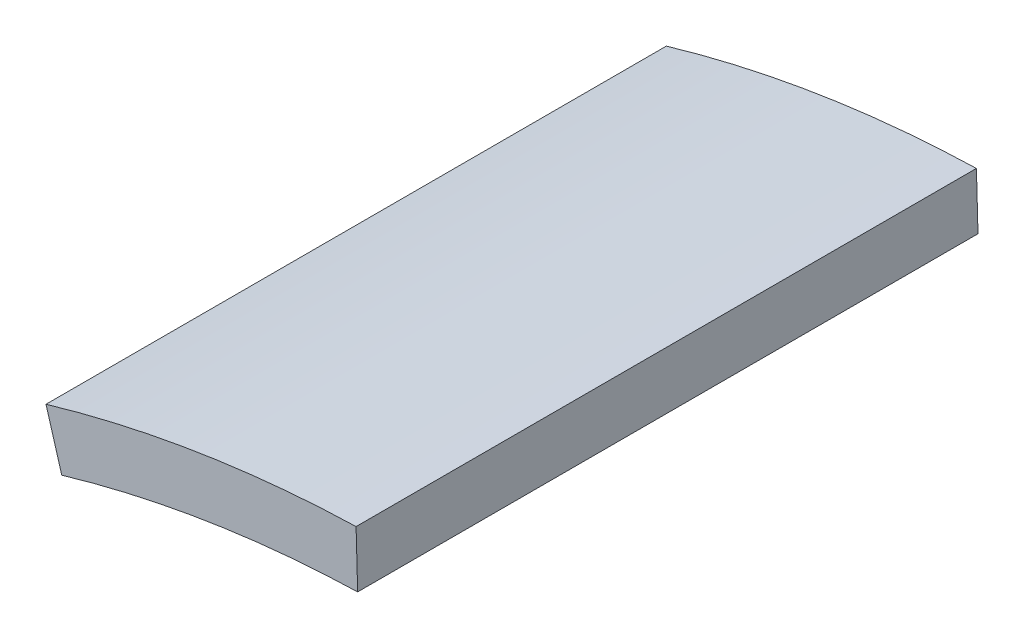
ISO-10303-21;
HEADER;
FILE_DESCRIPTION(('STEP AP214'),'2;1');
FILE_NAME('part.step','',(''),(''),'','','');
FILE_SCHEMA(('AUTOMOTIVE_DESIGN { 1 0 10303 214 1 1 1 1 }'));
ENDSEC;
DATA;
#1=APPLICATION_CONTEXT('core data for automotive mechanical design processes');
#2=APPLICATION_PROTOCOL_DEFINITION('international standard','automotive_design',2000,#1);
#3=PRODUCT_CONTEXT('',#1,'mechanical');
#4=PRODUCT('Part','Part','',(#3));
#5=PRODUCT_RELATED_PRODUCT_CATEGORY('part','',(#4));
#6=PRODUCT_DEFINITION_FORMATION('','',#4);
#7=PRODUCT_DEFINITION_CONTEXT('part definition',#1,'design');
#8=PRODUCT_DEFINITION('design','',#6,#7);
#9=PRODUCT_DEFINITION_SHAPE('','',#8);
#10=(LENGTH_UNIT() NAMED_UNIT(*) SI_UNIT(.MILLI.,.METRE.));
#11=(NAMED_UNIT(*) PLANE_ANGLE_UNIT() SI_UNIT($,.RADIAN.));
#12=(NAMED_UNIT(*) SI_UNIT($,.STERADIAN.) SOLID_ANGLE_UNIT());
#13=UNCERTAINTY_MEASURE_WITH_UNIT(LENGTH_MEASURE(1.E-05),#10,'distance_accuracy_value','');
#14=(GEOMETRIC_REPRESENTATION_CONTEXT(3) GLOBAL_UNCERTAINTY_ASSIGNED_CONTEXT((#13)) GLOBAL_UNIT_ASSIGNED_CONTEXT((#10,
#11,#12)) REPRESENTATION_CONTEXT('',''));
#15=CARTESIAN_POINT('',(0.,0.,0.));
#16=DIRECTION('',(0.,0.,1.));
#17=DIRECTION('',(1.,0.,0.));
#18=AXIS2_PLACEMENT_3D('',#15,#16,#17);
#19=CARTESIAN_POINT('',(0.,0.,50.));
#20=DIRECTION('',(0.,0.,1.));
#21=DIRECTION('',(1.,0.,0.));
#22=AXIS2_PLACEMENT_3D('',#19,#20,#21);
#23=PLANE('',#22);
#24=DIRECTION('',(-0.0282705667702734,0.999600307650257,0.));
#25=VECTOR('',#24,1.);
#26=CARTESIAN_POINT('',(-2.65743327640568,93.9624289191241,50.));
#27=LINE('',#26,#25);
#28=CARTESIAN_POINT('',(-2.65743327640568,93.9624289191241,50.));
#29=VERTEX_POINT('',#28);
#30=CARTESIAN_POINT('',(-2.78465082687191,98.4606303035503,50.));
#31=VERTEX_POINT('',#30);
#32=EDGE_CURVE('E86',#29,#31,#27,.T.);
#33=ORIENTED_EDGE('',*,*,#32,.F.);
#34=CARTESIAN_POINT('',(-3.67761376907083E-13,1.1518563880486E-12,50.));
#35=DIRECTION('',(0.,0.,1.));
#36=DIRECTION('',(1.,0.,0.));
#37=AXIS2_PLACEMENT_3D('',#34,#35,#36);
#38=CIRCLE('',#37,93.9999999999988);
#39=CARTESIAN_POINT('',(-26.5086181346121,90.18477235428,50.));
#40=VERTEX_POINT('',#39);
#41=EDGE_CURVE('E89',#40,#29,#38,.F.);
#42=ORIENTED_EDGE('',*,*,#41,.F.);
#43=DIRECTION('',(0.282006575900127,-0.959412471854044,0.));
#44=VECTOR('',#43,1.);
#45=CARTESIAN_POINT('',(-27.7776477261627,94.5021284776233,50.));
#46=LINE('',#45,#44);
#47=CARTESIAN_POINT('',(-27.7776477261627,94.5021284776233,50.));
#48=VERTEX_POINT('',#47);
#49=EDGE_CURVE('E39',#48,#40,#46,.T.);
#50=ORIENTED_EDGE('',*,*,#49,.F.);
#51=CARTESIAN_POINT('',(-3.67761376907083E-13,1.1518563880486E-12,50.));
#52=DIRECTION('',(0.,0.,1.));
#53=DIRECTION('',(1.,0.,0.));
#54=AXIS2_PLACEMENT_3D('',#51,#52,#53);
#55=CIRCLE('',#54,98.4999999999988);
#56=EDGE_CURVE('E11',#31,#48,#55,.T.);
#57=ORIENTED_EDGE('',*,*,#56,.F.);
#58=EDGE_LOOP('',(#33,#42,#50,#57));
#59=FACE_BOUND('',#58,.T.);
#60=ADVANCED_FACE('F32',(#59),#23,.F.);
#61=CARTESIAN_POINT('',(-27.7776477261627,94.5021284776233,100.));
#62=DIRECTION('',(0.959412471854044,0.282006575900127,0.));
#63=DIRECTION('',(-0.282006575900127,0.959412471854044,0.));
#64=AXIS2_PLACEMENT_3D('',#61,#62,#63);
#65=PLANE('',#64);
#66=DIRECTION('',(0.,0.,-1.));
#67=VECTOR('',#66,1.);
#68=CARTESIAN_POINT('',(-27.7776477261627,94.5021284776233,100.));
#69=LINE('',#68,#67);
#70=CARTESIAN_POINT('',(-27.7776477261627,94.5021284776233,100.));
#71=VERTEX_POINT('',#70);
#72=EDGE_CURVE('E71',#71,#48,#69,.T.);
#73=ORIENTED_EDGE('',*,*,#72,.T.);
#74=ORIENTED_EDGE('',*,*,#49,.T.);
#75=DIRECTION('',(0.,0.,-1.));
#76=VECTOR('',#75,1.);
#77=CARTESIAN_POINT('',(-26.5086181346121,90.18477235428,100.));
#78=LINE('',#77,#76);
#79=CARTESIAN_POINT('',(-26.5086181346121,90.18477235428,100.));
#80=VERTEX_POINT('',#79);
#81=EDGE_CURVE('E73',#80,#40,#78,.T.);
#82=ORIENTED_EDGE('',*,*,#81,.F.);
#83=DIRECTION('',(0.282006575900127,-0.959412471854044,0.));
#84=VECTOR('',#83,1.);
#85=CARTESIAN_POINT('',(-27.7776477261627,94.5021284776233,100.));
#86=LINE('',#85,#84);
#87=EDGE_CURVE('E68',#71,#80,#86,.T.);
#88=ORIENTED_EDGE('',*,*,#87,.F.);
#89=EDGE_LOOP('',(#73,#74,#82,#88));
#90=FACE_BOUND('',#89,.T.);
#91=ADVANCED_FACE('F70',(#90),#65,.F.);
#92=CARTESIAN_POINT('',(-3.67761376907083E-13,1.1518563880486E-12,100.));
#93=DIRECTION('',(0.,0.,1.));
#94=DIRECTION('',(1.,0.,0.));
#95=AXIS2_PLACEMENT_3D('',#92,#93,#94);
#96=PLANE('',#95);
#97=CARTESIAN_POINT('',(-3.67761376907083E-13,1.1518563880486E-12,100.));
#98=DIRECTION('',(0.,0.,1.));
#99=DIRECTION('',(1.,0.,0.));
#100=AXIS2_PLACEMENT_3D('',#97,#98,#99);
#101=CIRCLE('',#100,98.4999999999988);
#102=CARTESIAN_POINT('',(-2.78465082687191,98.4606303035503,100.));
#103=VERTEX_POINT('',#102);
#104=EDGE_CURVE('E77',#103,#71,#101,.T.);
#105=ORIENTED_EDGE('',*,*,#104,.T.);
#106=ORIENTED_EDGE('',*,*,#87,.T.);
#107=CARTESIAN_POINT('',(-3.67761376907083E-13,1.1518563880486E-12,100.));
#108=DIRECTION('',(0.,0.,-1.));
#109=DIRECTION('',(1.,0.,0.));
#110=AXIS2_PLACEMENT_3D('',#107,#108,#109);
#111=CIRCLE('',#110,93.9999999999988);
#112=CARTESIAN_POINT('',(-2.65743327640568,93.9624289191241,100.));
#113=VERTEX_POINT('',#112);
#114=EDGE_CURVE('E76',#80,#113,#111,.T.);
#115=ORIENTED_EDGE('',*,*,#114,.T.);
#116=DIRECTION('',(-0.0282705667702734,0.999600307650257,0.));
#117=VECTOR('',#116,1.);
#118=CARTESIAN_POINT('',(-2.65743327640568,93.9624289191241,100.));
#119=LINE('',#118,#117);
#120=EDGE_CURVE('E82',#113,#103,#119,.T.);
#121=ORIENTED_EDGE('',*,*,#120,.T.);
#122=EDGE_LOOP('',(#105,#106,#115,#121));
#123=FACE_BOUND('',#122,.T.);
#124=ADVANCED_FACE('F80',(#123),#96,.T.);
#125=CARTESIAN_POINT('',(-3.67761376907083E-13,1.1518563880486E-12,100.));
#126=DIRECTION('',(0.,0.,-1.));
#127=DIRECTION('',(-1.,0.,0.));
#128=AXIS2_PLACEMENT_3D('',#125,#126,#127);
#129=CYLINDRICAL_SURFACE('',#128,98.4999999999988);
#130=DIRECTION('',(0.,0.,-1.));
#131=VECTOR('',#130,1.);
#132=CARTESIAN_POINT('',(-2.78465082687191,98.4606303035503,100.));
#133=LINE('',#132,#131);
#134=EDGE_CURVE('E103',#103,#31,#133,.T.);
#135=ORIENTED_EDGE('',*,*,#134,.T.);
#136=ORIENTED_EDGE('',*,*,#56,.T.);
#137=ORIENTED_EDGE('',*,*,#72,.F.);
#138=ORIENTED_EDGE('',*,*,#104,.F.);
#139=EDGE_LOOP('',(#135,#136,#137,#138));
#140=FACE_BOUND('',#139,.T.);
#141=ADVANCED_FACE('F85',(#140),#129,.T.);
#142=CARTESIAN_POINT('',(-3.67761376907083E-13,1.1518563880486E-12,100.));
#143=DIRECTION('',(0.,0.,-1.));
#144=DIRECTION('',(-1.,0.,0.));
#145=AXIS2_PLACEMENT_3D('',#142,#143,#144);
#146=CYLINDRICAL_SURFACE('',#145,93.9999999999988);
#147=ORIENTED_EDGE('',*,*,#81,.T.);
#148=ORIENTED_EDGE('',*,*,#41,.T.);
#149=DIRECTION('',(0.,0.,-1.));
#150=VECTOR('',#149,1.);
#151=CARTESIAN_POINT('',(-2.65743327640568,93.9624289191241,100.));
#152=LINE('',#151,#150);
#153=EDGE_CURVE('E91',#113,#29,#152,.T.);
#154=ORIENTED_EDGE('',*,*,#153,.F.);
#155=ORIENTED_EDGE('',*,*,#114,.F.);
#156=EDGE_LOOP('',(#147,#148,#154,#155));
#157=FACE_BOUND('',#156,.T.);
#158=ADVANCED_FACE('F98',(#157),#146,.F.);
#159=CARTESIAN_POINT('',(-2.65743327640568,93.9624289191241,100.));
#160=DIRECTION('',(-0.999600307650257,-0.0282705667702734,0.));
#161=DIRECTION('',(0.0282705667702734,-0.999600307650257,0.));
#162=AXIS2_PLACEMENT_3D('',#159,#160,#161);
#163=PLANE('',#162);
#164=ORIENTED_EDGE('',*,*,#153,.T.);
#165=ORIENTED_EDGE('',*,*,#32,.T.);
#166=ORIENTED_EDGE('',*,*,#134,.F.);
#167=ORIENTED_EDGE('',*,*,#120,.F.);
#168=EDGE_LOOP('',(#164,#165,#166,#167));
#169=FACE_BOUND('',#168,.T.);
#170=ADVANCED_FACE('F102',(#169),#163,.F.);
#171=CLOSED_SHELL('',(#60,#91,#124,#141,#158,#170));
#172=MANIFOLD_SOLID_BREP('B2',#171);
#173=ADVANCED_BREP_SHAPE_REPRESENTATION('',(#18,#172),#14);
#174=SHAPE_DEFINITION_REPRESENTATION(#9,#173);
ENDSEC;
END-ISO-10303-21;
